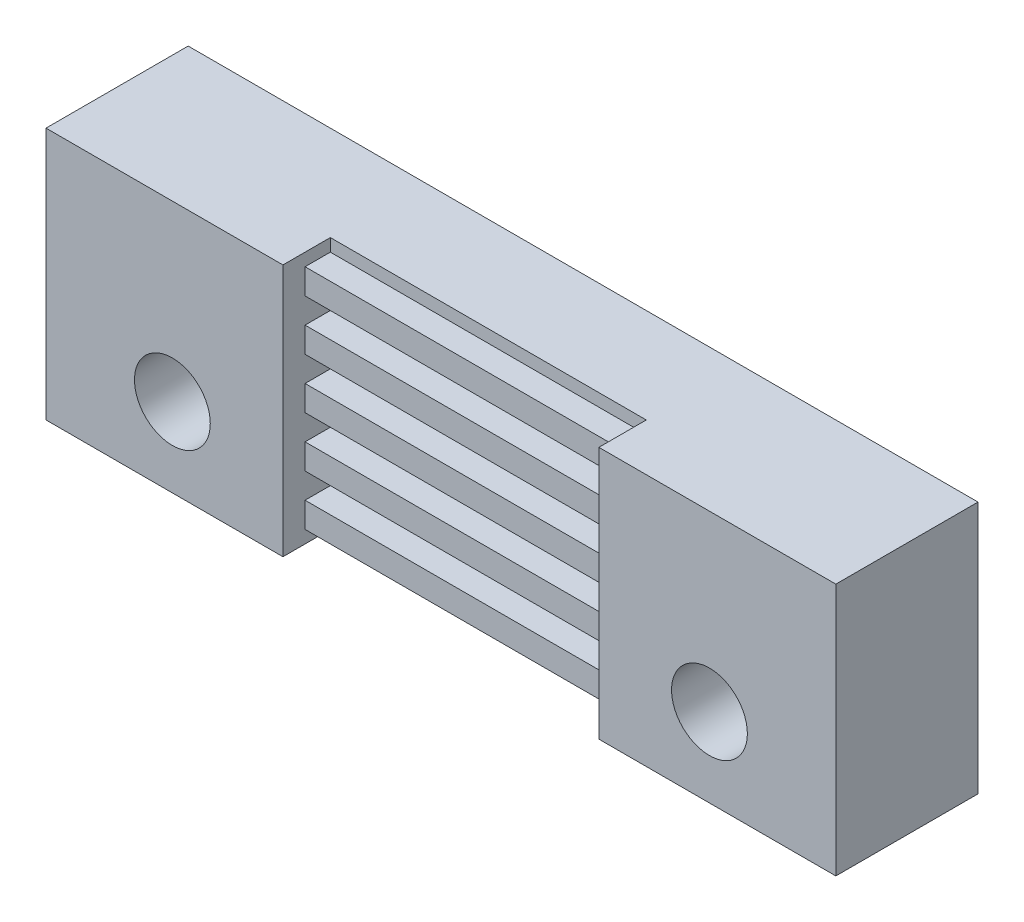
ISO-10303-21;
HEADER;
FILE_DESCRIPTION(('STEP AP214'),'2;1');
FILE_NAME('part.step','',(''),(''),'','','');
FILE_SCHEMA(('AUTOMOTIVE_DESIGN { 1 0 10303 214 1 1 1 1 }'));
ENDSEC;
DATA;
#1=APPLICATION_CONTEXT('core data for automotive mechanical design processes');
#2=APPLICATION_PROTOCOL_DEFINITION('international standard','automotive_design',2000,#1);
#3=PRODUCT_CONTEXT('',#1,'mechanical');
#4=PRODUCT('Part','Part','',(#3));
#5=PRODUCT_RELATED_PRODUCT_CATEGORY('part','',(#4));
#6=PRODUCT_DEFINITION_FORMATION('','',#4);
#7=PRODUCT_DEFINITION_CONTEXT('part definition',#1,'design');
#8=PRODUCT_DEFINITION('design','',#6,#7);
#9=PRODUCT_DEFINITION_SHAPE('','',#8);
#10=(LENGTH_UNIT() NAMED_UNIT(*) SI_UNIT(.MILLI.,.METRE.));
#11=(NAMED_UNIT(*) PLANE_ANGLE_UNIT() SI_UNIT($,.RADIAN.));
#12=(NAMED_UNIT(*) SI_UNIT($,.STERADIAN.) SOLID_ANGLE_UNIT());
#13=UNCERTAINTY_MEASURE_WITH_UNIT(LENGTH_MEASURE(1.E-05),#10,'distance_accuracy_value','');
#14=(GEOMETRIC_REPRESENTATION_CONTEXT(3) GLOBAL_UNCERTAINTY_ASSIGNED_CONTEXT((#13)) GLOBAL_UNIT_ASSIGNED_CONTEXT((#10,
#11,#12)) REPRESENTATION_CONTEXT('',''));
#15=CARTESIAN_POINT('',(0.,0.,0.));
#16=DIRECTION('',(0.,0.,1.));
#17=DIRECTION('',(1.,0.,0.));
#18=AXIS2_PLACEMENT_3D('',#15,#16,#17);
#19=CARTESIAN_POINT('',(0.,0.,4.));
#20=DIRECTION('',(0.,0.,1.));
#21=DIRECTION('',(1.,0.,0.));
#22=AXIS2_PLACEMENT_3D('',#19,#20,#21);
#23=PLANE('',#22);
#24=DIRECTION('',(1.,0.,0.));
#25=VECTOR('',#24,1.);
#26=CARTESIAN_POINT('',(-12.3902146884834,-4.54892655758304,4.));
#27=LINE('',#26,#25);
#28=CARTESIAN_POINT('',(-4.89021468848338,-4.54892655758304,4.));
#29=VERTEX_POINT('',#28);
#30=CARTESIAN_POINT('',(5.10978531151662,-4.54892655758304,4.));
#31=VERTEX_POINT('',#30);
#32=EDGE_CURVE('E61',#29,#31,#27,.T.);
#33=ORIENTED_EDGE('',*,*,#32,.T.);
#34=DIRECTION('',(0.,-1.,0.));
#35=VECTOR('',#34,1.);
#36=CARTESIAN_POINT('',(5.10978531151662,3.45107344241696,4.));
#37=LINE('',#36,#35);
#38=CARTESIAN_POINT('',(5.10978531151662,-4.14892655758304,4.));
#39=VERTEX_POINT('',#38);
#40=EDGE_CURVE('E415',#39,#31,#37,.T.);
#41=ORIENTED_EDGE('',*,*,#40,.F.);
#42=DIRECTION('',(1.,0.,0.));
#43=VECTOR('',#42,1.);
#44=CARTESIAN_POINT('',(0.,-4.14892655758304,4.));
#45=LINE('',#44,#43);
#46=CARTESIAN_POINT('',(-4.89021468848338,-4.14892655758304,4.));
#47=VERTEX_POINT('',#46);
#48=EDGE_CURVE('E259',#47,#39,#45,.T.);
#49=ORIENTED_EDGE('',*,*,#48,.F.);
#50=DIRECTION('',(0.,1.,0.));
#51=VECTOR('',#50,1.);
#52=CARTESIAN_POINT('',(-4.89021468848338,3.45107344241696,4.));
#53=LINE('',#52,#51);
#54=EDGE_CURVE('E386',#29,#47,#53,.T.);
#55=ORIENTED_EDGE('',*,*,#54,.F.);
#56=EDGE_LOOP('',(#33,#41,#49,#55));
#57=FACE_BOUND('',#56,.T.);
#58=ADVANCED_FACE('F37',(#57),#23,.T.);
#59=DIRECTION('',(-1.,0.,0.));
#60=VECTOR('',#59,1.);
#61=CARTESIAN_POINT('',(0.,-3.34892655758304,4.));
#62=LINE('',#61,#60);
#63=CARTESIAN_POINT('',(5.10978531151662,-3.34892655758304,4.));
#64=VERTEX_POINT('',#63);
#65=CARTESIAN_POINT('',(-4.89021468848338,-3.34892655758304,4.));
#66=VERTEX_POINT('',#65);
#67=EDGE_CURVE('E263',#64,#66,#62,.T.);
#68=ORIENTED_EDGE('',*,*,#67,.F.);
#69=CARTESIAN_POINT('',(5.10978531151662,-2.54892655758304,4.));
#70=VERTEX_POINT('',#69);
#71=EDGE_CURVE('E510',#70,#64,#37,.T.);
#72=ORIENTED_EDGE('',*,*,#71,.F.);
#73=DIRECTION('',(1.,0.,0.));
#74=VECTOR('',#73,1.);
#75=CARTESIAN_POINT('',(0.,-2.54892655758304,4.));
#76=LINE('',#75,#74);
#77=CARTESIAN_POINT('',(-4.89021468848338,-2.54892655758304,4.));
#78=VERTEX_POINT('',#77);
#79=EDGE_CURVE('E289',#78,#70,#76,.T.);
#80=ORIENTED_EDGE('',*,*,#79,.F.);
#81=EDGE_CURVE('E390',#66,#78,#53,.T.);
#82=ORIENTED_EDGE('',*,*,#81,.F.);
#83=EDGE_LOOP('',(#68,#72,#80,#82));
#84=FACE_BOUND('',#83,.T.);
#85=ADVANCED_FACE('F458',(#84),#23,.T.);
#86=DIRECTION('',(-1.,0.,0.));
#87=VECTOR('',#86,1.);
#88=CARTESIAN_POINT('',(0.,-1.74892655758304,4.));
#89=LINE('',#88,#87);
#90=CARTESIAN_POINT('',(5.10978531151662,-1.74892655758304,4.));
#91=VERTEX_POINT('',#90);
#92=CARTESIAN_POINT('',(-4.89021468848338,-1.74892655758304,4.));
#93=VERTEX_POINT('',#92);
#94=EDGE_CURVE('E285',#91,#93,#89,.T.);
#95=ORIENTED_EDGE('',*,*,#94,.F.);
#96=CARTESIAN_POINT('',(5.10978531151662,-0.948926557583041,4.));
#97=VERTEX_POINT('',#96);
#98=EDGE_CURVE('E513',#97,#91,#37,.T.);
#99=ORIENTED_EDGE('',*,*,#98,.F.);
#100=DIRECTION('',(1.,0.,0.));
#101=VECTOR('',#100,1.);
#102=CARTESIAN_POINT('',(0.,-0.948926557583041,4.));
#103=LINE('',#102,#101);
#104=CARTESIAN_POINT('',(-4.89021468848338,-0.948926557583041,4.));
#105=VERTEX_POINT('',#104);
#106=EDGE_CURVE('E314',#105,#97,#103,.T.);
#107=ORIENTED_EDGE('',*,*,#106,.F.);
#108=EDGE_CURVE('E498',#93,#105,#53,.T.);
#109=ORIENTED_EDGE('',*,*,#108,.F.);
#110=EDGE_LOOP('',(#95,#99,#107,#109));
#111=FACE_BOUND('',#110,.T.);
#112=ADVANCED_FACE('F464',(#111),#23,.T.);
#113=DIRECTION('',(-1.,0.,0.));
#114=VECTOR('',#113,1.);
#115=CARTESIAN_POINT('',(0.,-0.148926557583043,4.));
#116=LINE('',#115,#114);
#117=CARTESIAN_POINT('',(5.10978531151662,-0.148926557583043,4.));
#118=VERTEX_POINT('',#117);
#119=CARTESIAN_POINT('',(-4.89021468848338,-0.148926557583042,4.));
#120=VERTEX_POINT('',#119);
#121=EDGE_CURVE('E310',#118,#120,#116,.T.);
#122=ORIENTED_EDGE('',*,*,#121,.F.);
#123=CARTESIAN_POINT('',(5.10978531151662,0.651073442416958,4.));
#124=VERTEX_POINT('',#123);
#125=EDGE_CURVE('E515',#124,#118,#37,.T.);
#126=ORIENTED_EDGE('',*,*,#125,.F.);
#127=DIRECTION('',(1.,0.,0.));
#128=VECTOR('',#127,1.);
#129=CARTESIAN_POINT('',(0.,0.651073442416958,4.));
#130=LINE('',#129,#128);
#131=CARTESIAN_POINT('',(-4.89021468848338,0.651073442416958,4.));
#132=VERTEX_POINT('',#131);
#133=EDGE_CURVE('E340',#132,#124,#130,.T.);
#134=ORIENTED_EDGE('',*,*,#133,.F.);
#135=EDGE_CURVE('E495',#120,#132,#53,.T.);
#136=ORIENTED_EDGE('',*,*,#135,.F.);
#137=EDGE_LOOP('',(#122,#126,#134,#136));
#138=FACE_BOUND('',#137,.T.);
#139=ADVANCED_FACE('F477',(#138),#23,.T.);
#140=DIRECTION('',(-1.,0.,0.));
#141=VECTOR('',#140,1.);
#142=CARTESIAN_POINT('',(0.,1.45107344241696,4.));
#143=LINE('',#142,#141);
#144=CARTESIAN_POINT('',(5.10978531151662,1.45107344241696,4.));
#145=VERTEX_POINT('',#144);
#146=CARTESIAN_POINT('',(-4.89021468848338,1.45107344241696,4.));
#147=VERTEX_POINT('',#146);
#148=EDGE_CURVE('E336',#145,#147,#143,.T.);
#149=ORIENTED_EDGE('',*,*,#148,.F.);
#150=CARTESIAN_POINT('',(5.10978531151662,2.25107344241696,4.));
#151=VERTEX_POINT('',#150);
#152=EDGE_CURVE('E414',#151,#145,#37,.T.);
#153=ORIENTED_EDGE('',*,*,#152,.F.);
#154=DIRECTION('',(1.,0.,0.));
#155=VECTOR('',#154,1.);
#156=CARTESIAN_POINT('',(0.,2.25107344241696,4.));
#157=LINE('',#156,#155);
#158=CARTESIAN_POINT('',(-4.89021468848338,2.25107344241696,4.));
#159=VERTEX_POINT('',#158);
#160=EDGE_CURVE('E362',#159,#151,#157,.T.);
#161=ORIENTED_EDGE('',*,*,#160,.F.);
#162=EDGE_CURVE('E493',#147,#159,#53,.T.);
#163=ORIENTED_EDGE('',*,*,#162,.F.);
#164=EDGE_LOOP('',(#149,#153,#161,#163));
#165=FACE_BOUND('',#164,.T.);
#166=ADVANCED_FACE('F469',(#165),#23,.T.);
#167=DIRECTION('',(1.,0.,0.));
#168=VECTOR('',#167,1.);
#169=CARTESIAN_POINT('',(0.,3.05107344241696,4.));
#170=LINE('',#169,#168);
#171=CARTESIAN_POINT('',(-4.89021468848338,3.05107344241696,4.));
#172=VERTEX_POINT('',#171);
#173=CARTESIAN_POINT('',(5.10978531151662,3.05107344241696,4.));
#174=VERTEX_POINT('',#173);
#175=EDGE_CURVE('E366',#172,#174,#170,.T.);
#176=ORIENTED_EDGE('',*,*,#175,.T.);
#177=CARTESIAN_POINT('',(5.10978531151662,3.45107344241696,4.));
#178=VERTEX_POINT('',#177);
#179=EDGE_CURVE('E410',#178,#174,#37,.T.);
#180=ORIENTED_EDGE('',*,*,#179,.F.);
#181=DIRECTION('',(-1.,0.,0.));
#182=VECTOR('',#181,1.);
#183=CARTESIAN_POINT('',(12.6097853115166,3.45107344241696,4.));
#184=LINE('',#183,#182);
#185=CARTESIAN_POINT('',(-4.89021468848338,3.45107344241696,4.));
#186=VERTEX_POINT('',#185);
#187=EDGE_CURVE('E243',#178,#186,#184,.T.);
#188=ORIENTED_EDGE('',*,*,#187,.T.);
#189=EDGE_CURVE('E391',#172,#186,#53,.T.);
#190=ORIENTED_EDGE('',*,*,#189,.F.);
#191=EDGE_LOOP('',(#176,#180,#188,#190));
#192=FACE_BOUND('',#191,.T.);
#193=ADVANCED_FACE('F460',(#192),#23,.T.);
#194=CARTESIAN_POINT('',(-12.3902146884834,3.45107344241696,4.));
#195=DIRECTION('',(1.,0.,0.));
#196=DIRECTION('',(0.,0.,-1.));
#197=AXIS2_PLACEMENT_3D('',#194,#195,#196);
#198=PLANE('',#197);
#199=DIRECTION('',(0.,0.,-1.));
#200=VECTOR('',#199,1.);
#201=CARTESIAN_POINT('',(-12.3902146884834,3.45107344241696,4.));
#202=LINE('',#201,#200);
#203=CARTESIAN_POINT('',(-12.3902146884834,3.45107344241696,5.5));
#204=VERTEX_POINT('',#203);
#205=CARTESIAN_POINT('',(-12.3902146884834,3.45107344241696,1.));
#206=VERTEX_POINT('',#205);
#207=EDGE_CURVE('E240',#204,#206,#202,.T.);
#208=ORIENTED_EDGE('',*,*,#207,.T.);
#209=DIRECTION('',(0.,1.,0.));
#210=VECTOR('',#209,1.);
#211=CARTESIAN_POINT('',(-12.3902146884834,-16.048926557583,1.));
#212=LINE('',#211,#210);
#213=CARTESIAN_POINT('',(-12.3902146884834,-4.54892655758304,1.));
#214=VERTEX_POINT('',#213);
#215=EDGE_CURVE('E53',#214,#206,#212,.T.);
#216=ORIENTED_EDGE('',*,*,#215,.F.);
#217=DIRECTION('',(0.,0.,-1.));
#218=VECTOR('',#217,1.);
#219=CARTESIAN_POINT('',(-12.3902146884834,-4.54892655758304,4.));
#220=LINE('',#219,#218);
#221=CARTESIAN_POINT('',(-12.3902146884834,-4.54892655758304,5.5));
#222=VERTEX_POINT('',#221);
#223=EDGE_CURVE('E11',#222,#214,#220,.T.);
#224=ORIENTED_EDGE('',*,*,#223,.F.);
#225=DIRECTION('',(0.,-1.,0.));
#226=VECTOR('',#225,1.);
#227=CARTESIAN_POINT('',(-12.3902146884834,3.45107344241696,5.5));
#228=LINE('',#227,#226);
#229=EDGE_CURVE('E389',#204,#222,#228,.T.);
#230=ORIENTED_EDGE('',*,*,#229,.F.);
#231=EDGE_LOOP('',(#208,#216,#224,#230));
#232=FACE_BOUND('',#231,.T.);
#233=ADVANCED_FACE('F39',(#232),#198,.F.);
#234=CARTESIAN_POINT('',(-12.3902146884834,-4.54892655758304,4.));
#235=DIRECTION('',(0.,1.,0.));
#236=DIRECTION('',(0.,0.,1.));
#237=AXIS2_PLACEMENT_3D('',#234,#235,#236);
#238=PLANE('',#237);
#239=ORIENTED_EDGE('',*,*,#223,.T.);
#240=DIRECTION('',(1.,0.,0.));
#241=VECTOR('',#240,1.);
#242=CARTESIAN_POINT('',(-12.3902146884834,-4.54892655758304,1.));
#243=LINE('',#242,#241);
#244=CARTESIAN_POINT('',(12.6097853115166,-4.54892655758304,1.));
#245=VERTEX_POINT('',#244);
#246=EDGE_CURVE('E425',#214,#245,#243,.T.);
#247=ORIENTED_EDGE('',*,*,#246,.T.);
#248=DIRECTION('',(0.,0.,-1.));
#249=VECTOR('',#248,1.);
#250=CARTESIAN_POINT('',(12.6097853115166,-4.54892655758304,4.));
#251=LINE('',#250,#249);
#252=CARTESIAN_POINT('',(12.6097853115166,-4.54892655758304,5.5));
#253=VERTEX_POINT('',#252);
#254=EDGE_CURVE('E46',#253,#245,#251,.T.);
#255=ORIENTED_EDGE('',*,*,#254,.F.);
#256=DIRECTION('',(1.,0.,0.));
#257=VECTOR('',#256,1.);
#258=CARTESIAN_POINT('',(12.6097853115166,-4.54892655758304,5.5));
#259=LINE('',#258,#257);
#260=CARTESIAN_POINT('',(5.10978531151662,-4.54892655758304,5.5));
#261=VERTEX_POINT('',#260);
#262=EDGE_CURVE('E409',#261,#253,#259,.T.);
#263=ORIENTED_EDGE('',*,*,#262,.F.);
#264=DIRECTION('',(0.,0.,-1.));
#265=VECTOR('',#264,1.);
#266=CARTESIAN_POINT('',(5.10978531151662,-4.54892655758304,5.5));
#267=LINE('',#266,#265);
#268=EDGE_CURVE('E406',#261,#31,#267,.T.);
#269=ORIENTED_EDGE('',*,*,#268,.T.);
#270=ORIENTED_EDGE('',*,*,#32,.F.);
#271=DIRECTION('',(0.,0.,-1.));
#272=VECTOR('',#271,1.);
#273=CARTESIAN_POINT('',(-4.89021468848338,-4.54892655758304,5.5));
#274=LINE('',#273,#272);
#275=CARTESIAN_POINT('',(-4.89021468848338,-4.54892655758304,5.5));
#276=VERTEX_POINT('',#275);
#277=EDGE_CURVE('E369',#276,#29,#274,.T.);
#278=ORIENTED_EDGE('',*,*,#277,.F.);
#279=DIRECTION('',(1.,0.,0.));
#280=VECTOR('',#279,1.);
#281=CARTESIAN_POINT('',(-12.3902146884834,-4.54892655758304,5.5));
#282=LINE('',#281,#280);
#283=EDGE_CURVE('E396',#222,#276,#282,.T.);
#284=ORIENTED_EDGE('',*,*,#283,.F.);
#285=EDGE_LOOP('',(#239,#247,#255,#263,#269,#270,#278,#284));
#286=FACE_BOUND('',#285,.T.);
#287=ADVANCED_FACE('F475',(#286),#238,.F.);
#288=CARTESIAN_POINT('',(12.6097853115166,-4.54892655758304,4.));
#289=DIRECTION('',(-1.,0.,0.));
#290=DIRECTION('',(0.,0.,1.));
#291=AXIS2_PLACEMENT_3D('',#288,#289,#290);
#292=PLANE('',#291);
#293=ORIENTED_EDGE('',*,*,#254,.T.);
#294=DIRECTION('',(0.,1.,0.));
#295=VECTOR('',#294,1.);
#296=CARTESIAN_POINT('',(12.6097853115166,-16.048926557583,1.));
#297=LINE('',#296,#295);
#298=CARTESIAN_POINT('',(12.6097853115166,3.45107344241696,1.));
#299=VERTEX_POINT('',#298);
#300=EDGE_CURVE('E223',#245,#299,#297,.T.);
#301=ORIENTED_EDGE('',*,*,#300,.T.);
#302=DIRECTION('',(0.,0.,-1.));
#303=VECTOR('',#302,1.);
#304=CARTESIAN_POINT('',(12.6097853115166,3.45107344241696,4.));
#305=LINE('',#304,#303);
#306=CARTESIAN_POINT('',(12.6097853115166,3.45107344241696,5.5));
#307=VERTEX_POINT('',#306);
#308=EDGE_CURVE('E233',#307,#299,#305,.T.);
#309=ORIENTED_EDGE('',*,*,#308,.F.);
#310=DIRECTION('',(0.,1.,0.));
#311=VECTOR('',#310,1.);
#312=CARTESIAN_POINT('',(12.6097853115166,3.45107344241696,5.5));
#313=LINE('',#312,#311);
#314=EDGE_CURVE('E413',#253,#307,#313,.T.);
#315=ORIENTED_EDGE('',*,*,#314,.F.);
#316=EDGE_LOOP('',(#293,#301,#309,#315));
#317=FACE_BOUND('',#316,.T.);
#318=ADVANCED_FACE('F231',(#317),#292,.F.);
#319=CARTESIAN_POINT('',(12.6097853115166,3.45107344241696,4.));
#320=DIRECTION('',(0.,-1.,0.));
#321=DIRECTION('',(0.,0.,-1.));
#322=AXIS2_PLACEMENT_3D('',#319,#320,#321);
#323=PLANE('',#322);
#324=ORIENTED_EDGE('',*,*,#308,.T.);
#325=DIRECTION('',(1.,0.,0.));
#326=VECTOR('',#325,1.);
#327=CARTESIAN_POINT('',(-12.3902146884834,3.45107344241696,1.));
#328=LINE('',#327,#326);
#329=EDGE_CURVE('E220',#206,#299,#328,.T.);
#330=ORIENTED_EDGE('',*,*,#329,.F.);
#331=ORIENTED_EDGE('',*,*,#207,.F.);
#332=DIRECTION('',(-1.,0.,0.));
#333=VECTOR('',#332,1.);
#334=CARTESIAN_POINT('',(-12.3902146884834,3.45107344241696,5.5));
#335=LINE('',#334,#333);
#336=CARTESIAN_POINT('',(-4.89021468848338,3.45107344241696,5.5));
#337=VERTEX_POINT('',#336);
#338=EDGE_CURVE('E385',#337,#204,#335,.T.);
#339=ORIENTED_EDGE('',*,*,#338,.F.);
#340=DIRECTION('',(0.,0.,-1.));
#341=VECTOR('',#340,1.);
#342=CARTESIAN_POINT('',(-4.89021468848338,3.45107344241696,5.5));
#343=LINE('',#342,#341);
#344=EDGE_CURVE('E382',#337,#186,#343,.T.);
#345=ORIENTED_EDGE('',*,*,#344,.T.);
#346=ORIENTED_EDGE('',*,*,#187,.F.);
#347=DIRECTION('',(0.,0.,-1.));
#348=VECTOR('',#347,1.);
#349=CARTESIAN_POINT('',(5.10978531151662,3.45107344241696,5.5));
#350=LINE('',#349,#348);
#351=CARTESIAN_POINT('',(5.10978531151662,3.45107344241696,5.5));
#352=VERTEX_POINT('',#351);
#353=EDGE_CURVE('E403',#352,#178,#350,.T.);
#354=ORIENTED_EDGE('',*,*,#353,.F.);
#355=DIRECTION('',(-1.,0.,0.));
#356=VECTOR('',#355,1.);
#357=CARTESIAN_POINT('',(12.6097853115166,3.45107344241696,5.5));
#358=LINE('',#357,#356);
#359=EDGE_CURVE('E238',#307,#352,#358,.T.);
#360=ORIENTED_EDGE('',*,*,#359,.F.);
#361=EDGE_LOOP('',(#324,#330,#331,#339,#345,#346,#354,#360));
#362=FACE_BOUND('',#361,.T.);
#363=ADVANCED_FACE('F236',(#362),#323,.F.);
#364=CARTESIAN_POINT('',(-8.39021468848338,-2.04892655758304,4.));
#365=DIRECTION('',(0.,0.,-1.));
#366=DIRECTION('',(-1.,0.,0.));
#367=AXIS2_PLACEMENT_3D('',#364,#365,#366);
#368=CYLINDRICAL_SURFACE('',#367,1.2);
#369=CARTESIAN_POINT('',(-8.39021468848338,-2.04892655758304,1.));
#370=DIRECTION('',(0.,0.,1.));
#371=DIRECTION('',(1.,0.,0.));
#372=AXIS2_PLACEMENT_3D('',#369,#370,#371);
#373=CIRCLE('',#372,1.2);
#374=CARTESIAN_POINT('',(-7.19021468848338,-2.04892655758304,1.));
#375=VERTEX_POINT('',#374);
#376=EDGE_CURVE('E427',#375,#375,#373,.T.);
#377=ORIENTED_EDGE('',*,*,#376,.F.);
#378=EDGE_LOOP('',(#377));
#379=FACE_BOUND('',#378,.T.);
#380=CARTESIAN_POINT('',(-8.39021468848338,-2.04892655758304,5.5));
#381=DIRECTION('',(0.,0.,1.));
#382=DIRECTION('',(1.,0.,0.));
#383=AXIS2_PLACEMENT_3D('',#380,#381,#382);
#384=CIRCLE('',#383,1.2);
#385=CARTESIAN_POINT('',(-7.19021468848338,-2.04892655758304,5.5));
#386=VERTEX_POINT('',#385);
#387=EDGE_CURVE('E400',#386,#386,#384,.T.);
#388=ORIENTED_EDGE('',*,*,#387,.T.);
#389=EDGE_LOOP('',(#388));
#390=FACE_BOUND('',#389,.T.);
#391=ADVANCED_FACE('F440',(#379,#390),#368,.F.);
#392=CARTESIAN_POINT('',(8.60978531151662,-2.04892655758304,4.));
#393=DIRECTION('',(0.,0.,-1.));
#394=DIRECTION('',(-1.,0.,0.));
#395=AXIS2_PLACEMENT_3D('',#392,#393,#394);
#396=CYLINDRICAL_SURFACE('',#395,1.2);
#397=CARTESIAN_POINT('',(8.60978531151662,-2.04892655758304,1.));
#398=DIRECTION('',(0.,0.,1.));
#399=DIRECTION('',(1.,0.,0.));
#400=AXIS2_PLACEMENT_3D('',#397,#398,#399);
#401=CIRCLE('',#400,1.2);
#402=CARTESIAN_POINT('',(9.80978531151662,-2.04892655758304,1.));
#403=VERTEX_POINT('',#402);
#404=EDGE_CURVE('E41',#403,#403,#401,.T.);
#405=ORIENTED_EDGE('',*,*,#404,.F.);
#406=EDGE_LOOP('',(#405));
#407=FACE_BOUND('',#406,.T.);
#408=CARTESIAN_POINT('',(8.60978531151662,-2.04892655758304,5.5));
#409=DIRECTION('',(0.,0.,1.));
#410=DIRECTION('',(1.,0.,0.));
#411=AXIS2_PLACEMENT_3D('',#408,#409,#410);
#412=CIRCLE('',#411,1.2);
#413=CARTESIAN_POINT('',(9.80978531151662,-2.04892655758304,5.5));
#414=VERTEX_POINT('',#413);
#415=EDGE_CURVE('E422',#414,#414,#412,.T.);
#416=ORIENTED_EDGE('',*,*,#415,.T.);
#417=EDGE_LOOP('',(#416));
#418=FACE_BOUND('',#417,.T.);
#419=ADVANCED_FACE('F436',(#407,#418),#396,.F.);
#420=CARTESIAN_POINT('',(0.,-3.34892655758304,4.8));
#421=DIRECTION('',(0.,-1.,0.));
#422=DIRECTION('',(1.,0.,0.));
#423=AXIS2_PLACEMENT_3D('',#420,#421,#422);
#424=PLANE('',#423);
#425=ORIENTED_EDGE('',*,*,#67,.T.);
#426=DIRECTION('',(0.,0.,-1.));
#427=VECTOR('',#426,1.);
#428=CARTESIAN_POINT('',(-4.89021468848338,-3.34892655758304,4.8));
#429=LINE('',#428,#427);
#430=CARTESIAN_POINT('',(-4.89021468848338,-3.34892655758304,4.8));
#431=VERTEX_POINT('',#430);
#432=EDGE_CURVE('E250',#431,#66,#429,.T.);
#433=ORIENTED_EDGE('',*,*,#432,.F.);
#434=DIRECTION('',(-1.,0.,0.));
#435=VECTOR('',#434,1.);
#436=CARTESIAN_POINT('',(0.,-3.34892655758304,4.8));
#437=LINE('',#436,#435);
#438=CARTESIAN_POINT('',(5.10978531151662,-3.34892655758304,4.8));
#439=VERTEX_POINT('',#438);
#440=EDGE_CURVE('E271',#439,#431,#437,.T.);
#441=ORIENTED_EDGE('',*,*,#440,.F.);
#442=DIRECTION('',(0.,0.,-1.));
#443=VECTOR('',#442,1.);
#444=CARTESIAN_POINT('',(5.10978531151662,-3.34892655758304,4.8));
#445=LINE('',#444,#443);
#446=EDGE_CURVE('E248',#439,#64,#445,.T.);
#447=ORIENTED_EDGE('',*,*,#446,.T.);
#448=EDGE_LOOP('',(#425,#433,#441,#447));
#449=FACE_BOUND('',#448,.T.);
#450=ADVANCED_FACE('F439',(#449),#424,.F.);
#451=CARTESIAN_POINT('',(0.,-4.14892655758304,4.8));
#452=DIRECTION('',(0.,1.,0.));
#453=DIRECTION('',(0.,0.,1.));
#454=AXIS2_PLACEMENT_3D('',#451,#452,#453);
#455=PLANE('',#454);
#456=ORIENTED_EDGE('',*,*,#48,.T.);
#457=DIRECTION('',(0.,0.,-1.));
#458=VECTOR('',#457,1.);
#459=CARTESIAN_POINT('',(5.10978531151662,-4.14892655758304,4.8));
#460=LINE('',#459,#458);
#461=CARTESIAN_POINT('',(5.10978531151662,-4.14892655758304,4.8));
#462=VERTEX_POINT('',#461);
#463=EDGE_CURVE('E255',#462,#39,#460,.T.);
#464=ORIENTED_EDGE('',*,*,#463,.F.);
#465=DIRECTION('',(1.,0.,0.));
#466=VECTOR('',#465,1.);
#467=CARTESIAN_POINT('',(0.,-4.14892655758304,4.8));
#468=LINE('',#467,#466);
#469=CARTESIAN_POINT('',(-4.89021468848338,-4.14892655758304,4.8));
#470=VERTEX_POINT('',#469);
#471=EDGE_CURVE('E258',#470,#462,#468,.T.);
#472=ORIENTED_EDGE('',*,*,#471,.F.);
#473=DIRECTION('',(0.,0.,-1.));
#474=VECTOR('',#473,1.);
#475=CARTESIAN_POINT('',(-4.89021468848338,-4.14892655758304,4.8));
#476=LINE('',#475,#474);
#477=EDGE_CURVE('E253',#470,#47,#476,.T.);
#478=ORIENTED_EDGE('',*,*,#477,.T.);
#479=EDGE_LOOP('',(#456,#464,#472,#478));
#480=FACE_BOUND('',#479,.T.);
#481=ADVANCED_FACE('F527',(#480),#455,.F.);
#482=CARTESIAN_POINT('',(0.,0.,4.8));
#483=DIRECTION('',(0.,0.,1.));
#484=DIRECTION('',(1.,0.,0.));
#485=AXIS2_PLACEMENT_3D('',#482,#483,#484);
#486=PLANE('',#485);
#487=DIRECTION('',(0.,1.,0.));
#488=VECTOR('',#487,1.);
#489=CARTESIAN_POINT('',(5.10978531151662,0.,4.8));
#490=LINE('',#489,#488);
#491=EDGE_CURVE('E262',#462,#439,#490,.T.);
#492=ORIENTED_EDGE('',*,*,#491,.T.);
#493=ORIENTED_EDGE('',*,*,#440,.T.);
#494=DIRECTION('',(0.,1.,0.));
#495=VECTOR('',#494,1.);
#496=CARTESIAN_POINT('',(-4.89021468848338,0.,4.8));
#497=LINE('',#496,#495);
#498=EDGE_CURVE('E268',#470,#431,#497,.T.);
#499=ORIENTED_EDGE('',*,*,#498,.F.);
#500=ORIENTED_EDGE('',*,*,#471,.T.);
#501=EDGE_LOOP('',(#492,#493,#499,#500));
#502=FACE_BOUND('',#501,.T.);
#503=ADVANCED_FACE('F530',(#502),#486,.T.);
#504=CARTESIAN_POINT('',(0.,-2.54892655758304,4.8));
#505=DIRECTION('',(0.,1.,0.));
#506=DIRECTION('',(0.,0.,1.));
#507=AXIS2_PLACEMENT_3D('',#504,#505,#506);
#508=PLANE('',#507);
#509=ORIENTED_EDGE('',*,*,#79,.T.);
#510=DIRECTION('',(0.,0.,-1.));
#511=VECTOR('',#510,1.);
#512=CARTESIAN_POINT('',(5.10978531151662,-2.54892655758304,4.8));
#513=LINE('',#512,#511);
#514=CARTESIAN_POINT('',(5.10978531151662,-2.54892655758304,4.8));
#515=VERTEX_POINT('',#514);
#516=EDGE_CURVE('E276',#515,#70,#513,.T.);
#517=ORIENTED_EDGE('',*,*,#516,.F.);
#518=DIRECTION('',(1.,0.,0.));
#519=VECTOR('',#518,1.);
#520=CARTESIAN_POINT('',(0.,-2.54892655758304,4.8));
#521=LINE('',#520,#519);
#522=CARTESIAN_POINT('',(-4.89021468848338,-2.54892655758304,4.8));
#523=VERTEX_POINT('',#522);
#524=EDGE_CURVE('E296',#523,#515,#521,.T.);
#525=ORIENTED_EDGE('',*,*,#524,.F.);
#526=DIRECTION('',(0.,0.,-1.));
#527=VECTOR('',#526,1.);
#528=CARTESIAN_POINT('',(-4.89021468848338,-2.54892655758304,4.8));
#529=LINE('',#528,#527);
#530=EDGE_CURVE('E266',#523,#78,#529,.T.);
#531=ORIENTED_EDGE('',*,*,#530,.T.);
#532=EDGE_LOOP('',(#509,#517,#525,#531));
#533=FACE_BOUND('',#532,.T.);
#534=ADVANCED_FACE('F532',(#533),#508,.F.);
#535=CARTESIAN_POINT('',(0.,-1.74892655758304,4.8));
#536=DIRECTION('',(0.,-1.,0.));
#537=DIRECTION('',(1.,0.,0.));
#538=AXIS2_PLACEMENT_3D('',#535,#536,#537);
#539=PLANE('',#538);
#540=ORIENTED_EDGE('',*,*,#94,.T.);
#541=DIRECTION('',(0.,0.,-1.));
#542=VECTOR('',#541,1.);
#543=CARTESIAN_POINT('',(-4.89021468848338,-1.74892655758304,4.8));
#544=LINE('',#543,#542);
#545=CARTESIAN_POINT('',(-4.89021468848338,-1.74892655758304,4.8));
#546=VERTEX_POINT('',#545);
#547=EDGE_CURVE('E281',#546,#93,#544,.T.);
#548=ORIENTED_EDGE('',*,*,#547,.F.);
#549=DIRECTION('',(-1.,0.,0.));
#550=VECTOR('',#549,1.);
#551=CARTESIAN_POINT('',(0.,-1.74892655758304,4.8));
#552=LINE('',#551,#550);
#553=CARTESIAN_POINT('',(5.10978531151662,-1.74892655758304,4.8));
#554=VERTEX_POINT('',#553);
#555=EDGE_CURVE('E284',#554,#546,#552,.T.);
#556=ORIENTED_EDGE('',*,*,#555,.F.);
#557=DIRECTION('',(0.,0.,-1.));
#558=VECTOR('',#557,1.);
#559=CARTESIAN_POINT('',(5.10978531151662,-1.74892655758304,4.8));
#560=LINE('',#559,#558);
#561=EDGE_CURVE('E279',#554,#91,#560,.T.);
#562=ORIENTED_EDGE('',*,*,#561,.T.);
#563=EDGE_LOOP('',(#540,#548,#556,#562));
#564=FACE_BOUND('',#563,.T.);
#565=ADVANCED_FACE('F538',(#564),#539,.F.);
#566=CARTESIAN_POINT('',(0.,0.,4.8));
#567=DIRECTION('',(0.,0.,1.));
#568=DIRECTION('',(1.,0.,0.));
#569=AXIS2_PLACEMENT_3D('',#566,#567,#568);
#570=PLANE('',#569);
#571=DIRECTION('',(0.,1.,0.));
#572=VECTOR('',#571,1.);
#573=CARTESIAN_POINT('',(-4.89021468848338,0.,4.8));
#574=LINE('',#573,#572);
#575=EDGE_CURVE('E288',#523,#546,#574,.T.);
#576=ORIENTED_EDGE('',*,*,#575,.F.);
#577=ORIENTED_EDGE('',*,*,#524,.T.);
#578=DIRECTION('',(0.,1.,0.));
#579=VECTOR('',#578,1.);
#580=CARTESIAN_POINT('',(5.10978531151662,0.,4.8));
#581=LINE('',#580,#579);
#582=EDGE_CURVE('E294',#515,#554,#581,.T.);
#583=ORIENTED_EDGE('',*,*,#582,.T.);
#584=ORIENTED_EDGE('',*,*,#555,.T.);
#585=EDGE_LOOP('',(#576,#577,#583,#584));
#586=FACE_BOUND('',#585,.T.);
#587=ADVANCED_FACE('F593',(#586),#570,.T.);
#588=CARTESIAN_POINT('',(0.,-0.948926557583041,4.8));
#589=DIRECTION('',(0.,1.,0.));
#590=DIRECTION('',(0.,0.,1.));
#591=AXIS2_PLACEMENT_3D('',#588,#589,#590);
#592=PLANE('',#591);
#593=ORIENTED_EDGE('',*,*,#106,.T.);
#594=DIRECTION('',(0.,0.,-1.));
#595=VECTOR('',#594,1.);
#596=CARTESIAN_POINT('',(5.10978531151662,-0.948926557583041,4.8));
#597=LINE('',#596,#595);
#598=CARTESIAN_POINT('',(5.10978531151662,-0.948926557583041,4.8));
#599=VERTEX_POINT('',#598);
#600=EDGE_CURVE('E301',#599,#97,#597,.T.);
#601=ORIENTED_EDGE('',*,*,#600,.F.);
#602=DIRECTION('',(1.,0.,0.));
#603=VECTOR('',#602,1.);
#604=CARTESIAN_POINT('',(0.,-0.948926557583041,4.8));
#605=LINE('',#604,#603);
#606=CARTESIAN_POINT('',(-4.89021468848338,-0.948926557583041,4.8));
#607=VERTEX_POINT('',#606);
#608=EDGE_CURVE('E322',#607,#599,#605,.T.);
#609=ORIENTED_EDGE('',*,*,#608,.F.);
#610=DIRECTION('',(0.,0.,-1.));
#611=VECTOR('',#610,1.);
#612=CARTESIAN_POINT('',(-4.89021468848338,-0.948926557583041,4.8));
#613=LINE('',#612,#611);
#614=EDGE_CURVE('E292',#607,#105,#613,.T.);
#615=ORIENTED_EDGE('',*,*,#614,.T.);
#616=EDGE_LOOP('',(#593,#601,#609,#615));
#617=FACE_BOUND('',#616,.T.);
#618=ADVANCED_FACE('F589',(#617),#592,.F.);
#619=CARTESIAN_POINT('',(0.,-0.148926557583043,4.8));
#620=DIRECTION('',(0.,-1.,0.));
#621=DIRECTION('',(1.,0.,0.));
#622=AXIS2_PLACEMENT_3D('',#619,#620,#621);
#623=PLANE('',#622);
#624=ORIENTED_EDGE('',*,*,#121,.T.);
#625=DIRECTION('',(0.,0.,-1.));
#626=VECTOR('',#625,1.);
#627=CARTESIAN_POINT('',(-4.89021468848338,-0.148926557583042,4.8));
#628=LINE('',#627,#626);
#629=CARTESIAN_POINT('',(-4.89021468848338,-0.148926557583042,4.8));
#630=VERTEX_POINT('',#629);
#631=EDGE_CURVE('E306',#630,#120,#628,.T.);
#632=ORIENTED_EDGE('',*,*,#631,.F.);
#633=DIRECTION('',(-1.,0.,0.));
#634=VECTOR('',#633,1.);
#635=CARTESIAN_POINT('',(0.,-0.148926557583043,4.8));
#636=LINE('',#635,#634);
#637=CARTESIAN_POINT('',(5.10978531151662,-0.148926557583043,4.8));
#638=VERTEX_POINT('',#637);
#639=EDGE_CURVE('E309',#638,#630,#636,.T.);
#640=ORIENTED_EDGE('',*,*,#639,.F.);
#641=DIRECTION('',(0.,0.,-1.));
#642=VECTOR('',#641,1.);
#643=CARTESIAN_POINT('',(5.10978531151662,-0.148926557583043,4.8));
#644=LINE('',#643,#642);
#645=EDGE_CURVE('E304',#638,#118,#644,.T.);
#646=ORIENTED_EDGE('',*,*,#645,.T.);
#647=EDGE_LOOP('',(#624,#632,#640,#646));
#648=FACE_BOUND('',#647,.T.);
#649=ADVANCED_FACE('F585',(#648),#623,.F.);
#650=CARTESIAN_POINT('',(0.,0.,4.8));
#651=DIRECTION('',(0.,0.,1.));
#652=DIRECTION('',(1.,0.,0.));
#653=AXIS2_PLACEMENT_3D('',#650,#651,#652);
#654=PLANE('',#653);
#655=DIRECTION('',(0.,1.,0.));
#656=VECTOR('',#655,1.);
#657=CARTESIAN_POINT('',(-4.89021468848338,0.,4.8));
#658=LINE('',#657,#656);
#659=EDGE_CURVE('E313',#607,#630,#658,.T.);
#660=ORIENTED_EDGE('',*,*,#659,.F.);
#661=ORIENTED_EDGE('',*,*,#608,.T.);
#662=DIRECTION('',(0.,-1.,0.));
#663=VECTOR('',#662,1.);
#664=CARTESIAN_POINT('',(5.10978531151662,0.,4.8));
#665=LINE('',#664,#663);
#666=EDGE_CURVE('E319',#638,#599,#665,.T.);
#667=ORIENTED_EDGE('',*,*,#666,.F.);
#668=ORIENTED_EDGE('',*,*,#639,.T.);
#669=EDGE_LOOP('',(#660,#661,#667,#668));
#670=FACE_BOUND('',#669,.T.);
#671=ADVANCED_FACE('F581',(#670),#654,.T.);
#672=CARTESIAN_POINT('',(0.,0.651073442416958,4.8));
#673=DIRECTION('',(0.,1.,0.));
#674=DIRECTION('',(0.,0.,1.));
#675=AXIS2_PLACEMENT_3D('',#672,#673,#674);
#676=PLANE('',#675);
#677=ORIENTED_EDGE('',*,*,#133,.T.);
#678=DIRECTION('',(0.,0.,-1.));
#679=VECTOR('',#678,1.);
#680=CARTESIAN_POINT('',(5.10978531151662,0.651073442416958,4.8));
#681=LINE('',#680,#679);
#682=CARTESIAN_POINT('',(5.10978531151662,0.651073442416958,4.8));
#683=VERTEX_POINT('',#682);
#684=EDGE_CURVE('E327',#683,#124,#681,.T.);
#685=ORIENTED_EDGE('',*,*,#684,.F.);
#686=DIRECTION('',(1.,0.,0.));
#687=VECTOR('',#686,1.);
#688=CARTESIAN_POINT('',(0.,0.651073442416958,4.8));
#689=LINE('',#688,#687);
#690=CARTESIAN_POINT('',(-4.89021468848338,0.651073442416958,4.8));
#691=VERTEX_POINT('',#690);
#692=EDGE_CURVE('E348',#691,#683,#689,.T.);
#693=ORIENTED_EDGE('',*,*,#692,.F.);
#694=DIRECTION('',(0.,0.,-1.));
#695=VECTOR('',#694,1.);
#696=CARTESIAN_POINT('',(-4.89021468848338,0.651073442416958,4.8));
#697=LINE('',#696,#695);
#698=EDGE_CURVE('E317',#691,#132,#697,.T.);
#699=ORIENTED_EDGE('',*,*,#698,.T.);
#700=EDGE_LOOP('',(#677,#685,#693,#699));
#701=FACE_BOUND('',#700,.T.);
#702=ADVANCED_FACE('F577',(#701),#676,.F.);
#703=CARTESIAN_POINT('',(0.,1.45107344241696,4.8));
#704=DIRECTION('',(0.,-1.,0.));
#705=DIRECTION('',(1.,0.,0.));
#706=AXIS2_PLACEMENT_3D('',#703,#704,#705);
#707=PLANE('',#706);
#708=ORIENTED_EDGE('',*,*,#148,.T.);
#709=DIRECTION('',(0.,0.,-1.));
#710=VECTOR('',#709,1.);
#711=CARTESIAN_POINT('',(-4.89021468848338,1.45107344241696,4.8));
#712=LINE('',#711,#710);
#713=CARTESIAN_POINT('',(-4.89021468848338,1.45107344241696,4.8));
#714=VERTEX_POINT('',#713);
#715=EDGE_CURVE('E332',#714,#147,#712,.T.);
#716=ORIENTED_EDGE('',*,*,#715,.F.);
#717=DIRECTION('',(-1.,0.,0.));
#718=VECTOR('',#717,1.);
#719=CARTESIAN_POINT('',(0.,1.45107344241696,4.8));
#720=LINE('',#719,#718);
#721=CARTESIAN_POINT('',(5.10978531151662,1.45107344241696,4.8));
#722=VERTEX_POINT('',#721);
#723=EDGE_CURVE('E335',#722,#714,#720,.T.);
#724=ORIENTED_EDGE('',*,*,#723,.F.);
#725=DIRECTION('',(0.,0.,-1.));
#726=VECTOR('',#725,1.);
#727=CARTESIAN_POINT('',(5.10978531151662,1.45107344241696,4.8));
#728=LINE('',#727,#726);
#729=EDGE_CURVE('E330',#722,#145,#728,.T.);
#730=ORIENTED_EDGE('',*,*,#729,.T.);
#731=EDGE_LOOP('',(#708,#716,#724,#730));
#732=FACE_BOUND('',#731,.T.);
#733=ADVANCED_FACE('F573',(#732),#707,.F.);
#734=CARTESIAN_POINT('',(0.,0.,4.8));
#735=DIRECTION('',(0.,0.,1.));
#736=DIRECTION('',(1.,0.,0.));
#737=AXIS2_PLACEMENT_3D('',#734,#735,#736);
#738=PLANE('',#737);
#739=DIRECTION('',(0.,1.,0.));
#740=VECTOR('',#739,1.);
#741=CARTESIAN_POINT('',(-4.89021468848338,0.,4.8));
#742=LINE('',#741,#740);
#743=EDGE_CURVE('E339',#691,#714,#742,.T.);
#744=ORIENTED_EDGE('',*,*,#743,.F.);
#745=ORIENTED_EDGE('',*,*,#692,.T.);
#746=DIRECTION('',(0.,-1.,0.));
#747=VECTOR('',#746,1.);
#748=CARTESIAN_POINT('',(5.10978531151662,0.,4.8));
#749=LINE('',#748,#747);
#750=EDGE_CURVE('E345',#722,#683,#749,.T.);
#751=ORIENTED_EDGE('',*,*,#750,.F.);
#752=ORIENTED_EDGE('',*,*,#723,.T.);
#753=EDGE_LOOP('',(#744,#745,#751,#752));
#754=FACE_BOUND('',#753,.T.);
#755=ADVANCED_FACE('F570',(#754),#738,.T.);
#756=CARTESIAN_POINT('',(0.,3.05107344241696,4.8));
#757=DIRECTION('',(0.,1.,0.));
#758=DIRECTION('',(0.,0.,1.));
#759=AXIS2_PLACEMENT_3D('',#756,#757,#758);
#760=PLANE('',#759);
#761=ORIENTED_EDGE('',*,*,#175,.F.);
#762=DIRECTION('',(0.,0.,-1.));
#763=VECTOR('',#762,1.);
#764=CARTESIAN_POINT('',(-4.89021468848338,3.05107344241696,4.8));
#765=LINE('',#764,#763);
#766=CARTESIAN_POINT('',(-4.89021468848338,3.05107344241696,4.8));
#767=VERTEX_POINT('',#766);
#768=EDGE_CURVE('E353',#767,#172,#765,.T.);
#769=ORIENTED_EDGE('',*,*,#768,.F.);
#770=DIRECTION('',(1.,0.,0.));
#771=VECTOR('',#770,1.);
#772=CARTESIAN_POINT('',(0.,3.05107344241696,4.8));
#773=LINE('',#772,#771);
#774=CARTESIAN_POINT('',(5.10978531151662,3.05107344241696,4.8));
#775=VERTEX_POINT('',#774);
#776=EDGE_CURVE('E375',#767,#775,#773,.T.);
#777=ORIENTED_EDGE('',*,*,#776,.T.);
#778=DIRECTION('',(0.,0.,-1.));
#779=VECTOR('',#778,1.);
#780=CARTESIAN_POINT('',(5.10978531151662,3.05107344241696,4.8));
#781=LINE('',#780,#779);
#782=EDGE_CURVE('E343',#775,#174,#781,.T.);
#783=ORIENTED_EDGE('',*,*,#782,.T.);
#784=EDGE_LOOP('',(#761,#769,#777,#783));
#785=FACE_BOUND('',#784,.T.);
#786=ADVANCED_FACE('F566',(#785),#760,.T.);
#787=CARTESIAN_POINT('',(0.,2.25107344241696,4.8));
#788=DIRECTION('',(0.,1.,0.));
#789=DIRECTION('',(0.,0.,1.));
#790=AXIS2_PLACEMENT_3D('',#787,#788,#789);
#791=PLANE('',#790);
#792=ORIENTED_EDGE('',*,*,#160,.T.);
#793=DIRECTION('',(0.,0.,-1.));
#794=VECTOR('',#793,1.);
#795=CARTESIAN_POINT('',(5.10978531151662,2.25107344241696,4.8));
#796=LINE('',#795,#794);
#797=CARTESIAN_POINT('',(5.10978531151662,2.25107344241696,4.8));
#798=VERTEX_POINT('',#797);
#799=EDGE_CURVE('E358',#798,#151,#796,.T.);
#800=ORIENTED_EDGE('',*,*,#799,.F.);
#801=DIRECTION('',(1.,0.,0.));
#802=VECTOR('',#801,1.);
#803=CARTESIAN_POINT('',(0.,2.25107344241696,4.8));
#804=LINE('',#803,#802);
#805=CARTESIAN_POINT('',(-4.89021468848338,2.25107344241696,4.8));
#806=VERTEX_POINT('',#805);
#807=EDGE_CURVE('E361',#806,#798,#804,.T.);
#808=ORIENTED_EDGE('',*,*,#807,.F.);
#809=DIRECTION('',(0.,0.,-1.));
#810=VECTOR('',#809,1.);
#811=CARTESIAN_POINT('',(-4.89021468848338,2.25107344241696,4.8));
#812=LINE('',#811,#810);
#813=EDGE_CURVE('E356',#806,#159,#812,.T.);
#814=ORIENTED_EDGE('',*,*,#813,.T.);
#815=EDGE_LOOP('',(#792,#800,#808,#814));
#816=FACE_BOUND('',#815,.T.);
#817=ADVANCED_FACE('F562',(#816),#791,.F.);
#818=CARTESIAN_POINT('',(0.,0.,4.8));
#819=DIRECTION('',(0.,0.,1.));
#820=DIRECTION('',(1.,0.,0.));
#821=AXIS2_PLACEMENT_3D('',#818,#819,#820);
#822=PLANE('',#821);
#823=DIRECTION('',(0.,-1.,0.));
#824=VECTOR('',#823,1.);
#825=CARTESIAN_POINT('',(5.10978531151662,0.,4.8));
#826=LINE('',#825,#824);
#827=EDGE_CURVE('E365',#775,#798,#826,.T.);
#828=ORIENTED_EDGE('',*,*,#827,.F.);
#829=ORIENTED_EDGE('',*,*,#776,.F.);
#830=DIRECTION('',(0.,1.,0.));
#831=VECTOR('',#830,1.);
#832=CARTESIAN_POINT('',(-4.89021468848338,0.,4.8));
#833=LINE('',#832,#831);
#834=EDGE_CURVE('E372',#806,#767,#833,.T.);
#835=ORIENTED_EDGE('',*,*,#834,.F.);
#836=ORIENTED_EDGE('',*,*,#807,.T.);
#837=EDGE_LOOP('',(#828,#829,#835,#836));
#838=FACE_BOUND('',#837,.T.);
#839=ADVANCED_FACE('F557',(#838),#822,.T.);
#840=CARTESIAN_POINT('',(-4.89021468848338,3.45107344241696,5.5));
#841=DIRECTION('',(-1.,0.,0.));
#842=DIRECTION('',(0.,0.,1.));
#843=AXIS2_PLACEMENT_3D('',#840,#841,#842);
#844=PLANE('',#843);
#845=ORIENTED_EDGE('',*,*,#498,.T.);
#846=ORIENTED_EDGE('',*,*,#432,.T.);
#847=ORIENTED_EDGE('',*,*,#81,.T.);
#848=ORIENTED_EDGE('',*,*,#530,.F.);
#849=ORIENTED_EDGE('',*,*,#575,.T.);
#850=ORIENTED_EDGE('',*,*,#547,.T.);
#851=ORIENTED_EDGE('',*,*,#108,.T.);
#852=ORIENTED_EDGE('',*,*,#614,.F.);
#853=ORIENTED_EDGE('',*,*,#659,.T.);
#854=ORIENTED_EDGE('',*,*,#631,.T.);
#855=ORIENTED_EDGE('',*,*,#135,.T.);
#856=ORIENTED_EDGE('',*,*,#698,.F.);
#857=ORIENTED_EDGE('',*,*,#743,.T.);
#858=ORIENTED_EDGE('',*,*,#715,.T.);
#859=ORIENTED_EDGE('',*,*,#162,.T.);
#860=ORIENTED_EDGE('',*,*,#813,.F.);
#861=ORIENTED_EDGE('',*,*,#834,.T.);
#862=ORIENTED_EDGE('',*,*,#768,.T.);
#863=ORIENTED_EDGE('',*,*,#189,.T.);
#864=ORIENTED_EDGE('',*,*,#344,.F.);
#865=DIRECTION('',(0.,1.,0.));
#866=VECTOR('',#865,1.);
#867=CARTESIAN_POINT('',(-4.89021468848338,3.45107344241696,5.5));
#868=LINE('',#867,#866);
#869=EDGE_CURVE('E394',#276,#337,#868,.T.);
#870=ORIENTED_EDGE('',*,*,#869,.F.);
#871=ORIENTED_EDGE('',*,*,#277,.T.);
#872=ORIENTED_EDGE('',*,*,#54,.T.);
#873=ORIENTED_EDGE('',*,*,#477,.F.);
#874=EDGE_LOOP('',(#845,#846,#847,#848,#849,#850,#851,#852,#853,#854,#855,#856,#857,#858,#859,
#860,#861,#862,#863,#864,#870,#871,#872,#873));
#875=FACE_BOUND('',#874,.T.);
#876=ADVANCED_FACE('F491',(#875),#844,.F.);
#877=CARTESIAN_POINT('',(0.,0.,5.5));
#878=DIRECTION('',(0.,0.,1.));
#879=DIRECTION('',(1.,0.,0.));
#880=AXIS2_PLACEMENT_3D('',#877,#878,#879);
#881=PLANE('',#880);
#882=ORIENTED_EDGE('',*,*,#229,.T.);
#883=ORIENTED_EDGE('',*,*,#283,.T.);
#884=ORIENTED_EDGE('',*,*,#869,.T.);
#885=ORIENTED_EDGE('',*,*,#338,.T.);
#886=EDGE_LOOP('',(#882,#883,#884,#885));
#887=FACE_BOUND('',#886,.T.);
#888=ORIENTED_EDGE('',*,*,#387,.F.);
#889=EDGE_LOOP('',(#888));
#890=FACE_BOUND('',#889,.T.);
#891=ADVANCED_FACE('F454',(#887,#890),#881,.T.);
#892=CARTESIAN_POINT('',(5.10978531151662,3.45107344241696,5.5));
#893=DIRECTION('',(1.,0.,0.));
#894=DIRECTION('',(0.,0.,-1.));
#895=AXIS2_PLACEMENT_3D('',#892,#893,#894);
#896=PLANE('',#895);
#897=ORIENTED_EDGE('',*,*,#71,.T.);
#898=ORIENTED_EDGE('',*,*,#446,.F.);
#899=ORIENTED_EDGE('',*,*,#491,.F.);
#900=ORIENTED_EDGE('',*,*,#463,.T.);
#901=ORIENTED_EDGE('',*,*,#40,.T.);
#902=ORIENTED_EDGE('',*,*,#268,.F.);
#903=DIRECTION('',(0.,-1.,0.));
#904=VECTOR('',#903,1.);
#905=CARTESIAN_POINT('',(5.10978531151662,3.45107344241696,5.5));
#906=LINE('',#905,#904);
#907=EDGE_CURVE('E418',#352,#261,#906,.T.);
#908=ORIENTED_EDGE('',*,*,#907,.F.);
#909=ORIENTED_EDGE('',*,*,#353,.T.);
#910=ORIENTED_EDGE('',*,*,#179,.T.);
#911=ORIENTED_EDGE('',*,*,#782,.F.);
#912=ORIENTED_EDGE('',*,*,#827,.T.);
#913=ORIENTED_EDGE('',*,*,#799,.T.);
#914=ORIENTED_EDGE('',*,*,#152,.T.);
#915=ORIENTED_EDGE('',*,*,#729,.F.);
#916=ORIENTED_EDGE('',*,*,#750,.T.);
#917=ORIENTED_EDGE('',*,*,#684,.T.);
#918=ORIENTED_EDGE('',*,*,#125,.T.);
#919=ORIENTED_EDGE('',*,*,#645,.F.);
#920=ORIENTED_EDGE('',*,*,#666,.T.);
#921=ORIENTED_EDGE('',*,*,#600,.T.);
#922=ORIENTED_EDGE('',*,*,#98,.T.);
#923=ORIENTED_EDGE('',*,*,#561,.F.);
#924=ORIENTED_EDGE('',*,*,#582,.F.);
#925=ORIENTED_EDGE('',*,*,#516,.T.);
#926=EDGE_LOOP('',(#897,#898,#899,#900,#901,#902,#908,#909,#910,#911,#912,#913,#914,#915,#916,
#917,#918,#919,#920,#921,#922,#923,#924,#925));
#927=FACE_BOUND('',#926,.T.);
#928=ADVANCED_FACE('F446',(#927),#896,.F.);
#929=CARTESIAN_POINT('',(0.,0.,5.5));
#930=DIRECTION('',(0.,0.,-1.));
#931=DIRECTION('',(-1.,0.,0.));
#932=AXIS2_PLACEMENT_3D('',#929,#930,#931);
#933=PLANE('',#932);
#934=ORIENTED_EDGE('',*,*,#314,.T.);
#935=ORIENTED_EDGE('',*,*,#359,.T.);
#936=ORIENTED_EDGE('',*,*,#907,.T.);
#937=ORIENTED_EDGE('',*,*,#262,.T.);
#938=EDGE_LOOP('',(#934,#935,#936,#937));
#939=FACE_BOUND('',#938,.T.);
#940=ORIENTED_EDGE('',*,*,#415,.F.);
#941=EDGE_LOOP('',(#940));
#942=FACE_BOUND('',#941,.T.);
#943=ADVANCED_FACE('F444',(#939,#942),#933,.F.);
#944=CARTESIAN_POINT('',(-12.3902146884834,-16.048926557583,1.));
#945=DIRECTION('',(0.,0.,1.));
#946=DIRECTION('',(1.,0.,0.));
#947=AXIS2_PLACEMENT_3D('',#944,#945,#946);
#948=PLANE('',#947);
#949=ORIENTED_EDGE('',*,*,#376,.T.);
#950=EDGE_LOOP('',(#949));
#951=FACE_BOUND('',#950,.T.);
#952=ORIENTED_EDGE('',*,*,#404,.T.);
#953=EDGE_LOOP('',(#952));
#954=FACE_BOUND('',#953,.T.);
#955=ORIENTED_EDGE('',*,*,#215,.T.);
#956=ORIENTED_EDGE('',*,*,#329,.T.);
#957=ORIENTED_EDGE('',*,*,#300,.F.);
#958=ORIENTED_EDGE('',*,*,#246,.F.);
#959=EDGE_LOOP('',(#955,#956,#957,#958));
#960=FACE_BOUND('',#959,.T.);
#961=ADVANCED_FACE('F222',(#951,#954,#960),#948,.F.);
#962=CLOSED_SHELL('',(#58,#85,#112,#139,#166,#193,#233,#287,#318,#363,#391,#419,#450,#481,#503,
#534,#565,#587,#618,#649,#671,#702,#733,#755,#786,#817,#839,#876,#891,#928,#943,#961));
#963=MANIFOLD_SOLID_BREP('B2',#962);
#964=ADVANCED_BREP_SHAPE_REPRESENTATION('',(#18,#963),#14);
#965=SHAPE_DEFINITION_REPRESENTATION(#9,#964);
ENDSEC;
END-ISO-10303-21;
